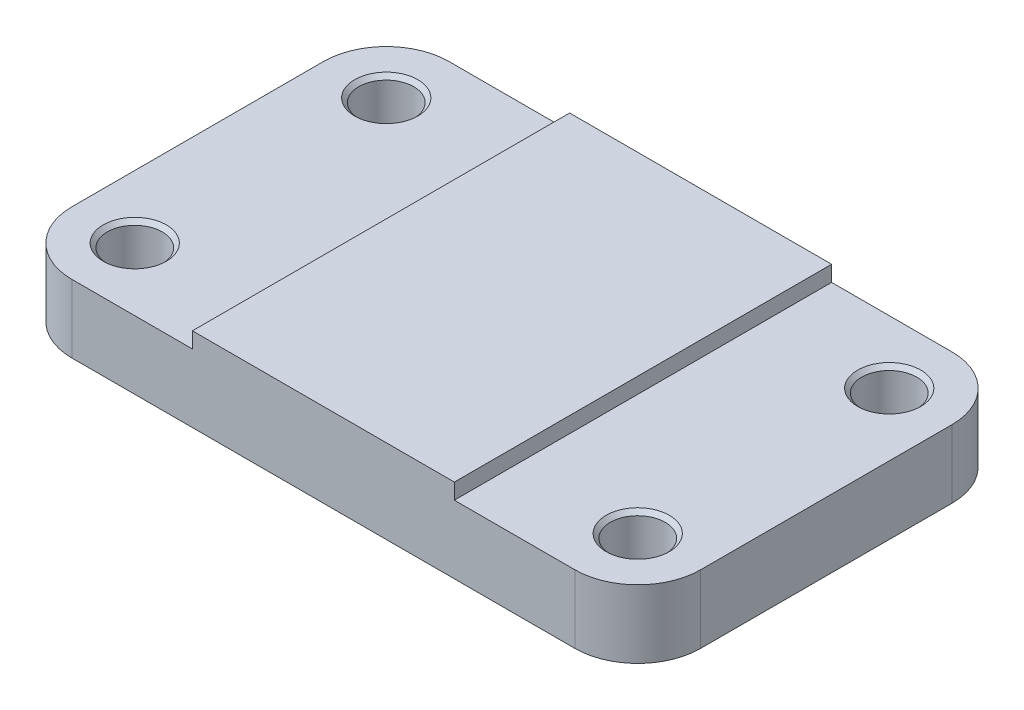
ISO-10303-21;
HEADER;
FILE_DESCRIPTION(('STEP AP214'),'2;1');
FILE_NAME('part.step','',(''),(''),'','','');
FILE_SCHEMA(('AUTOMOTIVE_DESIGN { 1 0 10303 214 1 1 1 1 }'));
ENDSEC;
DATA;
#1=APPLICATION_CONTEXT('core data for automotive mechanical design processes');
#2=APPLICATION_PROTOCOL_DEFINITION('international standard','automotive_design',2000,#1);
#3=PRODUCT_CONTEXT('',#1,'mechanical');
#4=PRODUCT('Part','Part','',(#3));
#5=PRODUCT_RELATED_PRODUCT_CATEGORY('part','',(#4));
#6=PRODUCT_DEFINITION_FORMATION('','',#4);
#7=PRODUCT_DEFINITION_CONTEXT('part definition',#1,'design');
#8=PRODUCT_DEFINITION('design','',#6,#7);
#9=PRODUCT_DEFINITION_SHAPE('','',#8);
#10=(LENGTH_UNIT() NAMED_UNIT(*) SI_UNIT(.MILLI.,.METRE.));
#11=(NAMED_UNIT(*) PLANE_ANGLE_UNIT() SI_UNIT($,.RADIAN.));
#12=(NAMED_UNIT(*) SI_UNIT($,.STERADIAN.) SOLID_ANGLE_UNIT());
#13=UNCERTAINTY_MEASURE_WITH_UNIT(LENGTH_MEASURE(1.E-05),#10,'distance_accuracy_value','');
#14=(GEOMETRIC_REPRESENTATION_CONTEXT(3) GLOBAL_UNCERTAINTY_ASSIGNED_CONTEXT((#13)) GLOBAL_UNIT_ASSIGNED_CONTEXT((#10,
#11,#12)) REPRESENTATION_CONTEXT('',''));
#15=CARTESIAN_POINT('',(0.,0.,0.));
#16=DIRECTION('',(0.,0.,1.));
#17=DIRECTION('',(1.,0.,0.));
#18=AXIS2_PLACEMENT_3D('',#15,#16,#17);
#19=CARTESIAN_POINT('',(-24.9999999999999,0.,-36.));
#20=DIRECTION('',(1.,0.,0.));
#21=DIRECTION('',(0.,0.,-1.));
#22=AXIS2_PLACEMENT_3D('',#19,#20,#21);
#23=PLANE('',#22);
#24=DIRECTION('',(0.,0.,1.));
#25=VECTOR('',#24,1.);
#26=CARTESIAN_POINT('',(-24.9999999999999,6.50000000000001,-36.));
#27=LINE('',#26,#25);
#28=CARTESIAN_POINT('',(-25.,6.50000000000001,-36.));
#29=VERTEX_POINT('',#28);
#30=CARTESIAN_POINT('',(-24.9999999999999,6.50000000000001,36.));
#31=VERTEX_POINT('',#30);
#32=EDGE_CURVE('E205',#29,#31,#27,.T.);
#33=ORIENTED_EDGE('',*,*,#32,.T.);
#34=DIRECTION('',(0.,1.,0.));
#35=VECTOR('',#34,1.);
#36=CARTESIAN_POINT('',(-24.9999999999999,0.,36.));
#37=LINE('',#36,#35);
#38=CARTESIAN_POINT('',(-24.9999999999999,9.49999999999999,36.));
#39=VERTEX_POINT('',#38);
#40=EDGE_CURVE('E197',#31,#39,#37,.T.);
#41=ORIENTED_EDGE('',*,*,#40,.T.);
#42=DIRECTION('',(0.,0.,1.));
#43=VECTOR('',#42,1.);
#44=CARTESIAN_POINT('',(-24.9999999999999,9.49999999999999,-36.));
#45=LINE('',#44,#43);
#46=CARTESIAN_POINT('',(-24.9999999999999,9.49999999999999,-36.));
#47=VERTEX_POINT('',#46);
#48=EDGE_CURVE('E209',#47,#39,#45,.T.);
#49=ORIENTED_EDGE('',*,*,#48,.F.);
#50=DIRECTION('',(0.,1.,0.));
#51=VECTOR('',#50,1.);
#52=CARTESIAN_POINT('',(-24.9999999999999,0.,-36.));
#53=LINE('',#52,#51);
#54=EDGE_CURVE('E158',#29,#47,#53,.T.);
#55=ORIENTED_EDGE('',*,*,#54,.F.);
#56=EDGE_LOOP('',(#33,#41,#49,#55));
#57=FACE_BOUND('',#56,.T.);
#58=ADVANCED_FACE('F61',(#57),#23,.F.);
#59=CARTESIAN_POINT('',(0.,9.49999999999999,-36.));
#60=DIRECTION('',(0.,-1.,0.));
#61=DIRECTION('',(0.,0.,-1.));
#62=AXIS2_PLACEMENT_3D('',#59,#60,#61);
#63=PLANE('',#62);
#64=ORIENTED_EDGE('',*,*,#48,.T.);
#65=DIRECTION('',(1.,0.,0.));
#66=VECTOR('',#65,1.);
#67=CARTESIAN_POINT('',(0.,9.49999999999999,36.));
#68=LINE('',#67,#66);
#69=CARTESIAN_POINT('',(25.,9.49999999999999,36.));
#70=VERTEX_POINT('',#69);
#71=EDGE_CURVE('E167',#39,#70,#68,.T.);
#72=ORIENTED_EDGE('',*,*,#71,.T.);
#73=DIRECTION('',(0.,0.,1.));
#74=VECTOR('',#73,1.);
#75=CARTESIAN_POINT('',(25.,9.49999999999999,-36.));
#76=LINE('',#75,#74);
#77=CARTESIAN_POINT('',(25.,9.49999999999999,-36.));
#78=VERTEX_POINT('',#77);
#79=EDGE_CURVE('E157',#78,#70,#76,.T.);
#80=ORIENTED_EDGE('',*,*,#79,.F.);
#81=DIRECTION('',(1.,0.,0.));
#82=VECTOR('',#81,1.);
#83=CARTESIAN_POINT('',(0.,9.49999999999999,-36.));
#84=LINE('',#83,#82);
#85=EDGE_CURVE('E202',#47,#78,#84,.T.);
#86=ORIENTED_EDGE('',*,*,#85,.F.);
#87=EDGE_LOOP('',(#64,#72,#80,#86));
#88=FACE_BOUND('',#87,.T.);
#89=ADVANCED_FACE('F337',(#88),#63,.F.);
#90=CARTESIAN_POINT('',(25.,0.,-36.));
#91=DIRECTION('',(1.,0.,0.));
#92=DIRECTION('',(0.,0.,-1.));
#93=AXIS2_PLACEMENT_3D('',#90,#91,#92);
#94=PLANE('',#93);
#95=ORIENTED_EDGE('',*,*,#79,.T.);
#96=DIRECTION('',(0.,1.,0.));
#97=VECTOR('',#96,1.);
#98=CARTESIAN_POINT('',(25.,0.,36.));
#99=LINE('',#98,#97);
#100=CARTESIAN_POINT('',(25.,6.50000000000001,36.));
#101=VERTEX_POINT('',#100);
#102=EDGE_CURVE('E161',#101,#70,#99,.T.);
#103=ORIENTED_EDGE('',*,*,#102,.F.);
#104=DIRECTION('',(0.,0.,1.));
#105=VECTOR('',#104,1.);
#106=CARTESIAN_POINT('',(25.,6.50000000000001,-36.));
#107=LINE('',#106,#105);
#108=CARTESIAN_POINT('',(25.,6.50000000000001,-36.));
#109=VERTEX_POINT('',#108);
#110=EDGE_CURVE('E147',#109,#101,#107,.T.);
#111=ORIENTED_EDGE('',*,*,#110,.F.);
#112=DIRECTION('',(0.,1.,0.));
#113=VECTOR('',#112,1.);
#114=CARTESIAN_POINT('',(25.,0.,-36.));
#115=LINE('',#114,#113);
#116=EDGE_CURVE('E200',#109,#78,#115,.T.);
#117=ORIENTED_EDGE('',*,*,#116,.T.);
#118=EDGE_LOOP('',(#95,#103,#111,#117));
#119=FACE_BOUND('',#118,.T.);
#120=ADVANCED_FACE('F162',(#119),#94,.T.);
#121=CARTESIAN_POINT('',(0.,0.,-36.));
#122=DIRECTION('',(0.,0.,1.));
#123=DIRECTION('',(1.,0.,0.));
#124=AXIS2_PLACEMENT_3D('',#121,#122,#123);
#125=PLANE('',#124);
#126=DIRECTION('',(1.,0.,0.));
#127=VECTOR('',#126,1.);
#128=CARTESIAN_POINT('',(-59.9999999999999,-6.50000000000001,-36.));
#129=LINE('',#128,#127);
#130=CARTESIAN_POINT('',(-47.9999999999999,-6.50000000000001,-36.));
#131=VERTEX_POINT('',#130);
#132=CARTESIAN_POINT('',(48.,-6.50000000000001,-36.));
#133=VERTEX_POINT('',#132);
#134=EDGE_CURVE('E177',#131,#133,#129,.T.);
#135=ORIENTED_EDGE('',*,*,#134,.F.);
#136=DIRECTION('',(0.,1.,0.));
#137=VECTOR('',#136,1.);
#138=CARTESIAN_POINT('',(-47.9999999999999,6.50000000000001,-36.));
#139=LINE('',#138,#137);
#140=CARTESIAN_POINT('',(-47.9999999999999,6.50000000000001,-36.));
#141=VERTEX_POINT('',#140);
#142=EDGE_CURVE('E213',#131,#141,#139,.T.);
#143=ORIENTED_EDGE('',*,*,#142,.T.);
#144=DIRECTION('',(1.,0.,0.));
#145=VECTOR('',#144,1.);
#146=CARTESIAN_POINT('',(-59.9999999999999,6.50000000000001,-36.));
#147=LINE('',#146,#145);
#148=EDGE_CURVE('E181',#141,#29,#147,.T.);
#149=ORIENTED_EDGE('',*,*,#148,.T.);
#150=ORIENTED_EDGE('',*,*,#54,.T.);
#151=ORIENTED_EDGE('',*,*,#85,.T.);
#152=ORIENTED_EDGE('',*,*,#116,.F.);
#153=CARTESIAN_POINT('',(48.,6.50000000000001,-36.));
#154=VERTEX_POINT('',#153);
#155=EDGE_CURVE('E153',#109,#154,#147,.T.);
#156=ORIENTED_EDGE('',*,*,#155,.T.);
#157=DIRECTION('',(0.,1.,0.));
#158=VECTOR('',#157,1.);
#159=CARTESIAN_POINT('',(48.0000000000001,0.,-36.));
#160=LINE('',#159,#158);
#161=EDGE_CURVE('E208',#154,#133,#160,.F.);
#162=ORIENTED_EDGE('',*,*,#161,.T.);
#163=EDGE_LOOP('',(#135,#143,#149,#150,#151,#152,#156,#162));
#164=FACE_BOUND('',#163,.T.);
#165=ADVANCED_FACE('F246',(#164),#125,.F.);
#166=CARTESIAN_POINT('',(-59.9999999999999,6.50000000000001,36.));
#167=DIRECTION('',(0.,1.,0.));
#168=DIRECTION('',(0.,0.,1.));
#169=AXIS2_PLACEMENT_3D('',#166,#167,#168);
#170=PLANE('',#169);
#171=CARTESIAN_POINT('',(-47.9999999999999,6.50000000000001,24.));
#172=DIRECTION('',(0.,1.,0.));
#173=DIRECTION('',(0.,0.,1.));
#174=AXIS2_PLACEMENT_3D('',#171,#172,#173);
#175=CIRCLE('',#174,6.025);
#176=CARTESIAN_POINT('',(-47.9999999999999,6.50000000000001,30.025));
#177=VERTEX_POINT('',#176);
#178=EDGE_CURVE('E309',#177,#177,#175,.T.);
#179=ORIENTED_EDGE('',*,*,#178,.F.);
#180=EDGE_LOOP('',(#179));
#181=FACE_BOUND('',#180,.T.);
#182=CARTESIAN_POINT('',(-47.9999999999999,6.50000000000001,-24.));
#183=DIRECTION('',(0.,1.,0.));
#184=DIRECTION('',(0.,0.,1.));
#185=AXIS2_PLACEMENT_3D('',#182,#183,#184);
#186=CIRCLE('',#185,6.025);
#187=CARTESIAN_POINT('',(-47.9999999999999,6.50000000000001,-17.975));
#188=VERTEX_POINT('',#187);
#189=EDGE_CURVE('E300',#188,#188,#186,.T.);
#190=ORIENTED_EDGE('',*,*,#189,.F.);
#191=EDGE_LOOP('',(#190));
#192=FACE_BOUND('',#191,.T.);
#193=ORIENTED_EDGE('',*,*,#148,.F.);
#194=CARTESIAN_POINT('',(-47.9999999999999,6.50000000000001,-24.));
#195=DIRECTION('',(0.,1.,0.));
#196=DIRECTION('',(0.,0.,1.));
#197=AXIS2_PLACEMENT_3D('',#194,#195,#196);
#198=CIRCLE('',#197,12.);
#199=CARTESIAN_POINT('',(-59.9999999999999,6.50000000000001,-24.));
#200=VERTEX_POINT('',#199);
#201=EDGE_CURVE('E218',#141,#200,#198,.T.);
#202=ORIENTED_EDGE('',*,*,#201,.T.);
#203=DIRECTION('',(0.,0.,-1.));
#204=VECTOR('',#203,1.);
#205=CARTESIAN_POINT('',(-59.9999999999999,6.50000000000001,36.));
#206=LINE('',#205,#204);
#207=CARTESIAN_POINT('',(-59.9999999999999,6.50000000000001,24.));
#208=VERTEX_POINT('',#207);
#209=EDGE_CURVE('E186',#208,#200,#206,.T.);
#210=ORIENTED_EDGE('',*,*,#209,.F.);
#211=CARTESIAN_POINT('',(-47.9999999999999,6.50000000000001,24.));
#212=DIRECTION('',(0.,1.,0.));
#213=DIRECTION('',(0.,0.,1.));
#214=AXIS2_PLACEMENT_3D('',#211,#212,#213);
#215=CIRCLE('',#214,12.);
#216=CARTESIAN_POINT('',(-47.9999999999999,6.50000000000001,36.));
#217=VERTEX_POINT('',#216);
#218=EDGE_CURVE('E216',#208,#217,#215,.T.);
#219=ORIENTED_EDGE('',*,*,#218,.T.);
#220=DIRECTION('',(1.,0.,0.));
#221=VECTOR('',#220,1.);
#222=CARTESIAN_POINT('',(-59.9999999999999,6.50000000000001,36.));
#223=LINE('',#222,#221);
#224=EDGE_CURVE('E176',#217,#31,#223,.T.);
#225=ORIENTED_EDGE('',*,*,#224,.T.);
#226=ORIENTED_EDGE('',*,*,#32,.F.);
#227=EDGE_LOOP('',(#193,#202,#210,#219,#225,#226));
#228=FACE_BOUND('',#227,.T.);
#229=ADVANCED_FACE('F260',(#181,#192,#228),#170,.T.);
#230=CARTESIAN_POINT('',(0.,0.,36.));
#231=DIRECTION('',(0.,0.,1.));
#232=DIRECTION('',(1.,0.,0.));
#233=AXIS2_PLACEMENT_3D('',#230,#231,#232);
#234=PLANE('',#233);
#235=ORIENTED_EDGE('',*,*,#224,.F.);
#236=DIRECTION('',(0.,1.,0.));
#237=VECTOR('',#236,1.);
#238=CARTESIAN_POINT('',(-47.9999999999999,0.,36.));
#239=LINE('',#238,#237);
#240=CARTESIAN_POINT('',(-47.9999999999999,-6.50000000000001,36.));
#241=VERTEX_POINT('',#240);
#242=EDGE_CURVE('E234',#217,#241,#239,.F.);
#243=ORIENTED_EDGE('',*,*,#242,.T.);
#244=DIRECTION('',(1.,0.,0.));
#245=VECTOR('',#244,1.);
#246=CARTESIAN_POINT('',(-59.9999999999999,-6.50000000000001,36.));
#247=LINE('',#246,#245);
#248=CARTESIAN_POINT('',(48.,-6.50000000000001,36.));
#249=VERTEX_POINT('',#248);
#250=EDGE_CURVE('E179',#241,#249,#247,.T.);
#251=ORIENTED_EDGE('',*,*,#250,.T.);
#252=DIRECTION('',(0.,1.,0.));
#253=VECTOR('',#252,1.);
#254=CARTESIAN_POINT('',(48.0000000000001,6.50000000000001,36.));
#255=LINE('',#254,#253);
#256=CARTESIAN_POINT('',(48.,6.50000000000001,36.));
#257=VERTEX_POINT('',#256);
#258=EDGE_CURVE('E175',#249,#257,#255,.T.);
#259=ORIENTED_EDGE('',*,*,#258,.T.);
#260=EDGE_CURVE('E151',#101,#257,#223,.T.);
#261=ORIENTED_EDGE('',*,*,#260,.F.);
#262=ORIENTED_EDGE('',*,*,#102,.T.);
#263=ORIENTED_EDGE('',*,*,#71,.F.);
#264=ORIENTED_EDGE('',*,*,#40,.F.);
#265=EDGE_LOOP('',(#235,#243,#251,#259,#261,#262,#263,#264));
#266=FACE_BOUND('',#265,.T.);
#267=ADVANCED_FACE('F172',(#266),#234,.T.);
#268=CARTESIAN_POINT('',(48.0000000000001,6.50000000000001,-24.));
#269=DIRECTION('',(0.,1.,0.));
#270=DIRECTION('',(0.,0.,1.));
#271=AXIS2_PLACEMENT_3D('',#268,#269,#270);
#272=CIRCLE('',#271,6.025);
#273=CARTESIAN_POINT('',(48.0000000000001,6.50000000000001,-17.975));
#274=VERTEX_POINT('',#273);
#275=EDGE_CURVE('E291',#274,#274,#272,.T.);
#276=ORIENTED_EDGE('',*,*,#275,.F.);
#277=EDGE_LOOP('',(#276));
#278=FACE_BOUND('',#277,.T.);
#279=CARTESIAN_POINT('',(48.0000000000001,6.50000000000001,24.));
#280=DIRECTION('',(0.,1.,0.));
#281=DIRECTION('',(0.,0.,1.));
#282=AXIS2_PLACEMENT_3D('',#279,#280,#281);
#283=CIRCLE('',#282,6.025);
#284=CARTESIAN_POINT('',(48.0000000000001,6.50000000000001,30.025));
#285=VERTEX_POINT('',#284);
#286=EDGE_CURVE('E282',#285,#285,#283,.T.);
#287=ORIENTED_EDGE('',*,*,#286,.F.);
#288=EDGE_LOOP('',(#287));
#289=FACE_BOUND('',#288,.T.);
#290=DIRECTION('',(0.,0.,-1.));
#291=VECTOR('',#290,1.);
#292=CARTESIAN_POINT('',(60.0000000000001,6.50000000000001,36.));
#293=LINE('',#292,#291);
#294=CARTESIAN_POINT('',(60.0000000000001,6.50000000000001,24.));
#295=VERTEX_POINT('',#294);
#296=CARTESIAN_POINT('',(60.0000000000001,6.50000000000001,-24.));
#297=VERTEX_POINT('',#296);
#298=EDGE_CURVE('E192',#295,#297,#293,.T.);
#299=ORIENTED_EDGE('',*,*,#298,.T.);
#300=CARTESIAN_POINT('',(48.0000000000001,6.50000000000001,-24.));
#301=DIRECTION('',(0.,1.,0.));
#302=DIRECTION('',(0.,0.,1.));
#303=AXIS2_PLACEMENT_3D('',#300,#301,#302);
#304=CIRCLE('',#303,12.);
#305=EDGE_CURVE('E13',#297,#154,#304,.T.);
#306=ORIENTED_EDGE('',*,*,#305,.T.);
#307=ORIENTED_EDGE('',*,*,#155,.F.);
#308=ORIENTED_EDGE('',*,*,#110,.T.);
#309=ORIENTED_EDGE('',*,*,#260,.T.);
#310=CARTESIAN_POINT('',(48.0000000000001,6.50000000000001,24.));
#311=DIRECTION('',(0.,1.,0.));
#312=DIRECTION('',(0.,0.,1.));
#313=AXIS2_PLACEMENT_3D('',#310,#311,#312);
#314=CIRCLE('',#313,12.);
#315=EDGE_CURVE('E69',#257,#295,#314,.T.);
#316=ORIENTED_EDGE('',*,*,#315,.T.);
#317=EDGE_LOOP('',(#299,#306,#307,#308,#309,#316));
#318=FACE_BOUND('',#317,.T.);
#319=ADVANCED_FACE('F149',(#278,#289,#318),#170,.T.);
#320=CARTESIAN_POINT('',(-59.9999999999999,-6.50000000000001,36.));
#321=DIRECTION('',(-1.,0.,0.));
#322=DIRECTION('',(0.,0.,1.));
#323=AXIS2_PLACEMENT_3D('',#320,#321,#322);
#324=PLANE('',#323);
#325=ORIENTED_EDGE('',*,*,#209,.T.);
#326=DIRECTION('',(0.,1.,0.));
#327=VECTOR('',#326,1.);
#328=CARTESIAN_POINT('',(-59.9999999999999,-6.50000000000001,-24.));
#329=LINE('',#328,#327);
#330=CARTESIAN_POINT('',(-59.9999999999999,-6.50000000000001,-24.));
#331=VERTEX_POINT('',#330);
#332=EDGE_CURVE('E223',#200,#331,#329,.F.);
#333=ORIENTED_EDGE('',*,*,#332,.T.);
#334=DIRECTION('',(0.,0.,-1.));
#335=VECTOR('',#334,1.);
#336=CARTESIAN_POINT('',(-59.9999999999999,-6.50000000000001,36.));
#337=LINE('',#336,#335);
#338=CARTESIAN_POINT('',(-59.9999999999999,-6.50000000000001,24.));
#339=VERTEX_POINT('',#338);
#340=EDGE_CURVE('E168',#339,#331,#337,.T.);
#341=ORIENTED_EDGE('',*,*,#340,.F.);
#342=DIRECTION('',(0.,1.,0.));
#343=VECTOR('',#342,1.);
#344=CARTESIAN_POINT('',(-59.9999999999999,-6.50000000000001,24.));
#345=LINE('',#344,#343);
#346=EDGE_CURVE('E220',#339,#208,#345,.T.);
#347=ORIENTED_EDGE('',*,*,#346,.T.);
#348=EDGE_LOOP('',(#325,#333,#341,#347));
#349=FACE_BOUND('',#348,.T.);
#350=ADVANCED_FACE('F263',(#349),#324,.T.);
#351=CARTESIAN_POINT('',(-59.9999999999999,-6.50000000000001,36.));
#352=DIRECTION('',(0.,1.,0.));
#353=DIRECTION('',(0.,0.,1.));
#354=AXIS2_PLACEMENT_3D('',#351,#352,#353);
#355=PLANE('',#354);
#356=CARTESIAN_POINT('',(-47.9999999999999,-6.50000000000001,24.));
#357=DIRECTION('',(0.,1.,0.));
#358=DIRECTION('',(0.,0.,1.));
#359=AXIS2_PLACEMENT_3D('',#356,#357,#358);
#360=CIRCLE('',#359,5.25);
#361=CARTESIAN_POINT('',(-47.9999999999999,-6.50000000000001,29.25));
#362=VERTEX_POINT('',#361);
#363=EDGE_CURVE('E303',#362,#362,#360,.T.);
#364=ORIENTED_EDGE('',*,*,#363,.T.);
#365=EDGE_LOOP('',(#364));
#366=FACE_BOUND('',#365,.T.);
#367=CARTESIAN_POINT('',(-47.9999999999999,-6.50000000000001,-24.));
#368=DIRECTION('',(0.,1.,0.));
#369=DIRECTION('',(0.,0.,1.));
#370=AXIS2_PLACEMENT_3D('',#367,#368,#369);
#371=CIRCLE('',#370,5.25);
#372=CARTESIAN_POINT('',(-47.9999999999999,-6.50000000000001,-18.75));
#373=VERTEX_POINT('',#372);
#374=EDGE_CURVE('E294',#373,#373,#371,.T.);
#375=ORIENTED_EDGE('',*,*,#374,.T.);
#376=EDGE_LOOP('',(#375));
#377=FACE_BOUND('',#376,.T.);
#378=CARTESIAN_POINT('',(48.0000000000001,-6.50000000000001,-24.));
#379=DIRECTION('',(0.,1.,0.));
#380=DIRECTION('',(0.,0.,1.));
#381=AXIS2_PLACEMENT_3D('',#378,#379,#380);
#382=CIRCLE('',#381,5.25);
#383=CARTESIAN_POINT('',(48.0000000000001,-6.50000000000001,-18.75));
#384=VERTEX_POINT('',#383);
#385=EDGE_CURVE('E285',#384,#384,#382,.T.);
#386=ORIENTED_EDGE('',*,*,#385,.T.);
#387=EDGE_LOOP('',(#386));
#388=FACE_BOUND('',#387,.T.);
#389=CARTESIAN_POINT('',(48.0000000000001,-6.50000000000001,24.));
#390=DIRECTION('',(0.,1.,0.));
#391=DIRECTION('',(0.,0.,1.));
#392=AXIS2_PLACEMENT_3D('',#389,#390,#391);
#393=CIRCLE('',#392,5.25);
#394=CARTESIAN_POINT('',(48.0000000000001,-6.50000000000001,29.25));
#395=VERTEX_POINT('',#394);
#396=EDGE_CURVE('E247',#395,#395,#393,.T.);
#397=ORIENTED_EDGE('',*,*,#396,.T.);
#398=EDGE_LOOP('',(#397));
#399=FACE_BOUND('',#398,.T.);
#400=ORIENTED_EDGE('',*,*,#340,.T.);
#401=CARTESIAN_POINT('',(-47.9999999999999,-6.50000000000001,-24.));
#402=DIRECTION('',(0.,1.,0.));
#403=DIRECTION('',(0.,0.,1.));
#404=AXIS2_PLACEMENT_3D('',#401,#402,#403);
#405=CIRCLE('',#404,12.);
#406=EDGE_CURVE('E231',#331,#131,#405,.F.);
#407=ORIENTED_EDGE('',*,*,#406,.T.);
#408=ORIENTED_EDGE('',*,*,#134,.T.);
#409=CARTESIAN_POINT('',(48.0000000000001,-6.50000000000001,-24.));
#410=DIRECTION('',(0.,1.,0.));
#411=DIRECTION('',(0.,0.,1.));
#412=AXIS2_PLACEMENT_3D('',#409,#410,#411);
#413=CIRCLE('',#412,12.);
#414=CARTESIAN_POINT('',(60.0000000000001,-6.50000000000001,-24.));
#415=VERTEX_POINT('',#414);
#416=EDGE_CURVE('E227',#133,#415,#413,.F.);
#417=ORIENTED_EDGE('',*,*,#416,.T.);
#418=DIRECTION('',(0.,0.,-1.));
#419=VECTOR('',#418,1.);
#420=CARTESIAN_POINT('',(60.0000000000001,-6.50000000000001,36.));
#421=LINE('',#420,#419);
#422=CARTESIAN_POINT('',(60.0000000000001,-6.50000000000001,24.));
#423=VERTEX_POINT('',#422);
#424=EDGE_CURVE('E189',#423,#415,#421,.T.);
#425=ORIENTED_EDGE('',*,*,#424,.F.);
#426=CARTESIAN_POINT('',(48.0000000000001,-6.50000000000001,24.));
#427=DIRECTION('',(0.,1.,0.));
#428=DIRECTION('',(0.,0.,1.));
#429=AXIS2_PLACEMENT_3D('',#426,#427,#428);
#430=CIRCLE('',#429,12.);
#431=EDGE_CURVE('E225',#423,#249,#430,.F.);
#432=ORIENTED_EDGE('',*,*,#431,.T.);
#433=ORIENTED_EDGE('',*,*,#250,.F.);
#434=CARTESIAN_POINT('',(-47.9999999999999,-6.50000000000001,24.));
#435=DIRECTION('',(0.,1.,0.));
#436=DIRECTION('',(0.,0.,1.));
#437=AXIS2_PLACEMENT_3D('',#434,#435,#436);
#438=CIRCLE('',#437,12.);
#439=EDGE_CURVE('E229',#241,#339,#438,.F.);
#440=ORIENTED_EDGE('',*,*,#439,.T.);
#441=EDGE_LOOP('',(#400,#407,#408,#417,#425,#432,#433,#440));
#442=FACE_BOUND('',#441,.T.);
#443=ADVANCED_FACE('F250',(#366,#377,#388,#399,#442),#355,.F.);
#444=CARTESIAN_POINT('',(60.0000000000001,-6.50000000000001,36.));
#445=DIRECTION('',(-1.,0.,0.));
#446=DIRECTION('',(0.,0.,1.));
#447=AXIS2_PLACEMENT_3D('',#444,#445,#446);
#448=PLANE('',#447);
#449=ORIENTED_EDGE('',*,*,#424,.T.);
#450=DIRECTION('',(0.,1.,0.));
#451=VECTOR('',#450,1.);
#452=CARTESIAN_POINT('',(60.0000000000001,-6.50000000000001,-24.));
#453=LINE('',#452,#451);
#454=EDGE_CURVE('E238',#415,#297,#453,.T.);
#455=ORIENTED_EDGE('',*,*,#454,.T.);
#456=ORIENTED_EDGE('',*,*,#298,.F.);
#457=DIRECTION('',(0.,1.,0.));
#458=VECTOR('',#457,1.);
#459=CARTESIAN_POINT('',(60.0000000000001,-6.50000000000001,24.));
#460=LINE('',#459,#458);
#461=EDGE_CURVE('E236',#295,#423,#460,.F.);
#462=ORIENTED_EDGE('',*,*,#461,.T.);
#463=EDGE_LOOP('',(#449,#455,#456,#462));
#464=FACE_BOUND('',#463,.T.);
#465=ADVANCED_FACE('F240',(#464),#448,.F.);
#466=CARTESIAN_POINT('',(-47.9999999999999,0.,-24.));
#467=DIRECTION('',(0.,-1.,0.));
#468=DIRECTION('',(0.,0.,-1.));
#469=AXIS2_PLACEMENT_3D('',#466,#467,#468);
#470=CYLINDRICAL_SURFACE('',#469,12.);
#471=ORIENTED_EDGE('',*,*,#406,.F.);
#472=ORIENTED_EDGE('',*,*,#332,.F.);
#473=ORIENTED_EDGE('',*,*,#201,.F.);
#474=ORIENTED_EDGE('',*,*,#142,.F.);
#475=EDGE_LOOP('',(#471,#472,#473,#474));
#476=FACE_BOUND('',#475,.T.);
#477=ADVANCED_FACE('F256',(#476),#470,.T.);
#478=CARTESIAN_POINT('',(-47.9999999999999,-6.50000000000001,24.));
#479=DIRECTION('',(0.,1.,0.));
#480=DIRECTION('',(0.,0.,1.));
#481=AXIS2_PLACEMENT_3D('',#478,#479,#480);
#482=CYLINDRICAL_SURFACE('',#481,12.);
#483=ORIENTED_EDGE('',*,*,#439,.F.);
#484=ORIENTED_EDGE('',*,*,#242,.F.);
#485=ORIENTED_EDGE('',*,*,#218,.F.);
#486=ORIENTED_EDGE('',*,*,#346,.F.);
#487=EDGE_LOOP('',(#483,#484,#485,#486));
#488=FACE_BOUND('',#487,.T.);
#489=ADVANCED_FACE('F268',(#488),#482,.T.);
#490=CARTESIAN_POINT('',(48.0000000000001,-6.50000000000001,-24.));
#491=DIRECTION('',(0.,1.,0.));
#492=DIRECTION('',(0.,0.,1.));
#493=AXIS2_PLACEMENT_3D('',#490,#491,#492);
#494=CYLINDRICAL_SURFACE('',#493,12.);
#495=ORIENTED_EDGE('',*,*,#416,.F.);
#496=ORIENTED_EDGE('',*,*,#161,.F.);
#497=ORIENTED_EDGE('',*,*,#305,.F.);
#498=ORIENTED_EDGE('',*,*,#454,.F.);
#499=EDGE_LOOP('',(#495,#496,#497,#498));
#500=FACE_BOUND('',#499,.T.);
#501=ADVANCED_FACE('F248',(#500),#494,.T.);
#502=CARTESIAN_POINT('',(48.0000000000001,0.,24.));
#503=DIRECTION('',(0.,-1.,0.));
#504=DIRECTION('',(0.,0.,-1.));
#505=AXIS2_PLACEMENT_3D('',#502,#503,#504);
#506=CYLINDRICAL_SURFACE('',#505,12.);
#507=ORIENTED_EDGE('',*,*,#431,.F.);
#508=ORIENTED_EDGE('',*,*,#461,.F.);
#509=ORIENTED_EDGE('',*,*,#315,.F.);
#510=ORIENTED_EDGE('',*,*,#258,.F.);
#511=EDGE_LOOP('',(#507,#508,#509,#510));
#512=FACE_BOUND('',#511,.T.);
#513=ADVANCED_FACE('F63',(#512),#506,.T.);
#514=CARTESIAN_POINT('',(48.0000000000001,6.50000000000001,24.));
#515=DIRECTION('',(0.,1.,0.));
#516=DIRECTION('',(0.,0.,1.));
#517=AXIS2_PLACEMENT_3D('',#514,#515,#516);
#518=CYLINDRICAL_SURFACE('',#517,5.25);
#519=ORIENTED_EDGE('',*,*,#396,.F.);
#520=EDGE_LOOP('',(#519));
#521=FACE_BOUND('',#520,.T.);
#522=CARTESIAN_POINT('',(48.0000000000001,5.72499999999999,24.));
#523=DIRECTION('',(0.,1.,0.));
#524=DIRECTION('',(0.,0.,1.));
#525=AXIS2_PLACEMENT_3D('',#522,#523,#524);
#526=CIRCLE('',#525,5.25);
#527=CARTESIAN_POINT('',(48.0000000000001,5.72499999999999,29.25));
#528=VERTEX_POINT('',#527);
#529=EDGE_CURVE('E279',#528,#528,#526,.T.);
#530=ORIENTED_EDGE('',*,*,#529,.T.);
#531=EDGE_LOOP('',(#530));
#532=FACE_BOUND('',#531,.T.);
#533=ADVANCED_FACE('F356',(#521,#532),#518,.F.);
#534=CARTESIAN_POINT('',(48.0000000000001,6.50000000000001,24.));
#535=DIRECTION('',(0.,1.,0.));
#536=DIRECTION('',(0.,0.,1.));
#537=AXIS2_PLACEMENT_3D('',#534,#535,#536);
#538=CONICAL_SURFACE('',#537,6.025,0.785398163397449);
#539=ORIENTED_EDGE('',*,*,#529,.F.);
#540=EDGE_LOOP('',(#539));
#541=FACE_BOUND('',#540,.T.);
#542=ORIENTED_EDGE('',*,*,#286,.T.);
#543=EDGE_LOOP('',(#542));
#544=FACE_BOUND('',#543,.T.);
#545=ADVANCED_FACE('F361',(#541,#544),#538,.F.);
#546=CARTESIAN_POINT('',(48.0000000000001,6.50000000000001,-24.));
#547=DIRECTION('',(0.,1.,0.));
#548=DIRECTION('',(0.,0.,1.));
#549=AXIS2_PLACEMENT_3D('',#546,#547,#548);
#550=CYLINDRICAL_SURFACE('',#549,5.25);
#551=ORIENTED_EDGE('',*,*,#385,.F.);
#552=EDGE_LOOP('',(#551));
#553=FACE_BOUND('',#552,.T.);
#554=CARTESIAN_POINT('',(48.0000000000001,5.72499999999999,-24.));
#555=DIRECTION('',(0.,1.,0.));
#556=DIRECTION('',(0.,0.,1.));
#557=AXIS2_PLACEMENT_3D('',#554,#555,#556);
#558=CIRCLE('',#557,5.25);
#559=CARTESIAN_POINT('',(48.0000000000001,5.72499999999999,-18.75));
#560=VERTEX_POINT('',#559);
#561=EDGE_CURVE('E288',#560,#560,#558,.T.);
#562=ORIENTED_EDGE('',*,*,#561,.T.);
#563=EDGE_LOOP('',(#562));
#564=FACE_BOUND('',#563,.T.);
#565=ADVANCED_FACE('F367',(#553,#564),#550,.F.);
#566=CARTESIAN_POINT('',(48.0000000000001,6.50000000000001,-24.));
#567=DIRECTION('',(0.,1.,0.));
#568=DIRECTION('',(0.,0.,1.));
#569=AXIS2_PLACEMENT_3D('',#566,#567,#568);
#570=CONICAL_SURFACE('',#569,6.025,0.785398163397449);
#571=ORIENTED_EDGE('',*,*,#561,.F.);
#572=EDGE_LOOP('',(#571));
#573=FACE_BOUND('',#572,.T.);
#574=ORIENTED_EDGE('',*,*,#275,.T.);
#575=EDGE_LOOP('',(#574));
#576=FACE_BOUND('',#575,.T.);
#577=ADVANCED_FACE('F332',(#573,#576),#570,.F.);
#578=CARTESIAN_POINT('',(-47.9999999999999,6.50000000000001,-24.));
#579=DIRECTION('',(0.,1.,0.));
#580=DIRECTION('',(0.,0.,1.));
#581=AXIS2_PLACEMENT_3D('',#578,#579,#580);
#582=CYLINDRICAL_SURFACE('',#581,5.25);
#583=ORIENTED_EDGE('',*,*,#374,.F.);
#584=EDGE_LOOP('',(#583));
#585=FACE_BOUND('',#584,.T.);
#586=CARTESIAN_POINT('',(-47.9999999999999,5.72499999999999,-24.));
#587=DIRECTION('',(0.,1.,0.));
#588=DIRECTION('',(0.,0.,1.));
#589=AXIS2_PLACEMENT_3D('',#586,#587,#588);
#590=CIRCLE('',#589,5.25);
#591=CARTESIAN_POINT('',(-47.9999999999999,5.72499999999999,-18.75));
#592=VERTEX_POINT('',#591);
#593=EDGE_CURVE('E297',#592,#592,#590,.T.);
#594=ORIENTED_EDGE('',*,*,#593,.T.);
#595=EDGE_LOOP('',(#594));
#596=FACE_BOUND('',#595,.T.);
#597=ADVANCED_FACE('F323',(#585,#596),#582,.F.);
#598=CARTESIAN_POINT('',(-47.9999999999999,6.50000000000001,-24.));
#599=DIRECTION('',(0.,1.,0.));
#600=DIRECTION('',(0.,0.,1.));
#601=AXIS2_PLACEMENT_3D('',#598,#599,#600);
#602=CONICAL_SURFACE('',#601,6.025,0.785398163397449);
#603=ORIENTED_EDGE('',*,*,#593,.F.);
#604=EDGE_LOOP('',(#603));
#605=FACE_BOUND('',#604,.T.);
#606=ORIENTED_EDGE('',*,*,#189,.T.);
#607=EDGE_LOOP('',(#606));
#608=FACE_BOUND('',#607,.T.);
#609=ADVANCED_FACE('F320',(#605,#608),#602,.F.);
#610=CARTESIAN_POINT('',(-47.9999999999999,6.50000000000001,24.));
#611=DIRECTION('',(0.,1.,0.));
#612=DIRECTION('',(0.,0.,1.));
#613=AXIS2_PLACEMENT_3D('',#610,#611,#612);
#614=CYLINDRICAL_SURFACE('',#613,5.25);
#615=ORIENTED_EDGE('',*,*,#363,.F.);
#616=EDGE_LOOP('',(#615));
#617=FACE_BOUND('',#616,.T.);
#618=CARTESIAN_POINT('',(-47.9999999999999,5.72499999999999,24.));
#619=DIRECTION('',(0.,1.,0.));
#620=DIRECTION('',(0.,0.,1.));
#621=AXIS2_PLACEMENT_3D('',#618,#619,#620);
#622=CIRCLE('',#621,5.25);
#623=CARTESIAN_POINT('',(-47.9999999999999,5.72499999999999,29.25));
#624=VERTEX_POINT('',#623);
#625=EDGE_CURVE('E306',#624,#624,#622,.T.);
#626=ORIENTED_EDGE('',*,*,#625,.T.);
#627=EDGE_LOOP('',(#626));
#628=FACE_BOUND('',#627,.T.);
#629=ADVANCED_FACE('F322',(#617,#628),#614,.F.);
#630=CARTESIAN_POINT('',(-47.9999999999999,6.50000000000001,24.));
#631=DIRECTION('',(0.,1.,0.));
#632=DIRECTION('',(0.,0.,1.));
#633=AXIS2_PLACEMENT_3D('',#630,#631,#632);
#634=CONICAL_SURFACE('',#633,6.025,0.785398163397449);
#635=ORIENTED_EDGE('',*,*,#625,.F.);
#636=EDGE_LOOP('',(#635));
#637=FACE_BOUND('',#636,.T.);
#638=ORIENTED_EDGE('',*,*,#178,.T.);
#639=EDGE_LOOP('',(#638));
#640=FACE_BOUND('',#639,.T.);
#641=ADVANCED_FACE('F313',(#637,#640),#634,.F.);
#642=CLOSED_SHELL('',(#58,#89,#120,#165,#229,#267,#319,#350,#443,#465,#477,#489,#501,#513,#533,
#545,#565,#577,#597,#609,#629,#641));
#643=MANIFOLD_SOLID_BREP('B2',#642);
#644=ADVANCED_BREP_SHAPE_REPRESENTATION('',(#18,#643),#14);
#645=SHAPE_DEFINITION_REPRESENTATION(#9,#644);
ENDSEC;
END-ISO-10303-21;
